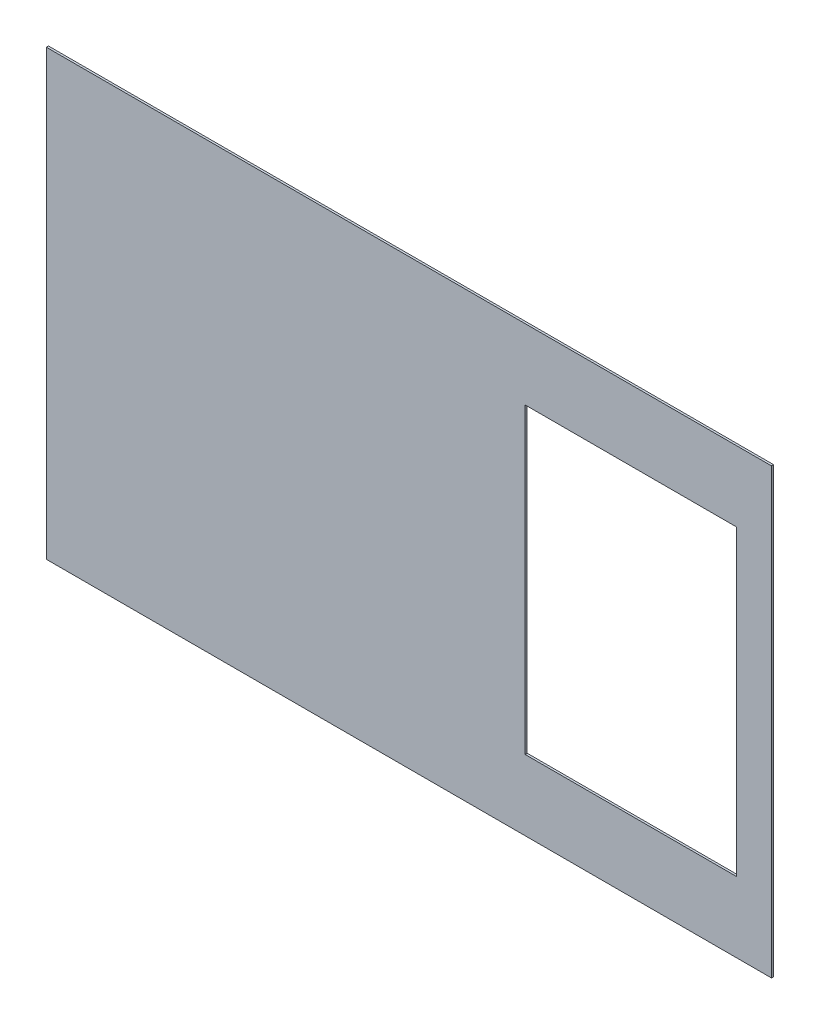
ISO-10303-21;
HEADER;
FILE_DESCRIPTION(('STEP AP214'),'2;1');
FILE_NAME('part.step','',(''),(''),'','','');
FILE_SCHEMA(('AUTOMOTIVE_DESIGN { 1 0 10303 214 1 1 1 1 }'));
ENDSEC;
DATA;
#1=APPLICATION_CONTEXT('core data for automotive mechanical design processes');
#2=APPLICATION_PROTOCOL_DEFINITION('international standard','automotive_design',2000,#1);
#3=PRODUCT_CONTEXT('',#1,'mechanical');
#4=PRODUCT('Part','Part','',(#3));
#5=PRODUCT_RELATED_PRODUCT_CATEGORY('part','',(#4));
#6=PRODUCT_DEFINITION_FORMATION('','',#4);
#7=PRODUCT_DEFINITION_CONTEXT('part definition',#1,'design');
#8=PRODUCT_DEFINITION('design','',#6,#7);
#9=PRODUCT_DEFINITION_SHAPE('','',#8);
#10=(LENGTH_UNIT() NAMED_UNIT(*) SI_UNIT(.MILLI.,.METRE.));
#11=(NAMED_UNIT(*) PLANE_ANGLE_UNIT() SI_UNIT($,.RADIAN.));
#12=(NAMED_UNIT(*) SI_UNIT($,.STERADIAN.) SOLID_ANGLE_UNIT());
#13=UNCERTAINTY_MEASURE_WITH_UNIT(LENGTH_MEASURE(1.E-05),#10,'distance_accuracy_value','');
#14=(GEOMETRIC_REPRESENTATION_CONTEXT(3) GLOBAL_UNCERTAINTY_ASSIGNED_CONTEXT((#13)) GLOBAL_UNIT_ASSIGNED_CONTEXT((#10,
#11,#12)) REPRESENTATION_CONTEXT('',''));
#15=CARTESIAN_POINT('',(0.,0.,0.));
#16=DIRECTION('',(0.,0.,1.));
#17=DIRECTION('',(1.,0.,0.));
#18=AXIS2_PLACEMENT_3D('',#15,#16,#17);
#19=CARTESIAN_POINT('',(515.,-315.,3.));
#20=DIRECTION('',(-1.,0.,0.));
#21=DIRECTION('',(0.,0.,1.));
#22=AXIS2_PLACEMENT_3D('',#19,#20,#21);
#23=PLANE('',#22);
#24=DIRECTION('',(0.,1.,0.));
#25=VECTOR('',#24,1.);
#26=CARTESIAN_POINT('',(515.,-315.,0.));
#27=LINE('',#26,#25);
#28=CARTESIAN_POINT('',(515.,-315.,0.));
#29=VERTEX_POINT('',#28);
#30=CARTESIAN_POINT('',(515.,315.,0.));
#31=VERTEX_POINT('',#30);
#32=EDGE_CURVE('E133',#29,#31,#27,.T.);
#33=ORIENTED_EDGE('',*,*,#32,.T.);
#34=DIRECTION('',(0.,0.,-1.));
#35=VECTOR('',#34,1.);
#36=CARTESIAN_POINT('',(515.,315.,3.));
#37=LINE('',#36,#35);
#38=CARTESIAN_POINT('',(515.,315.,3.));
#39=VERTEX_POINT('',#38);
#40=EDGE_CURVE('E11',#39,#31,#37,.T.);
#41=ORIENTED_EDGE('',*,*,#40,.F.);
#42=DIRECTION('',(0.,1.,0.));
#43=VECTOR('',#42,1.);
#44=CARTESIAN_POINT('',(515.,-315.,3.));
#45=LINE('',#44,#43);
#46=CARTESIAN_POINT('',(515.,-315.,3.));
#47=VERTEX_POINT('',#46);
#48=EDGE_CURVE('E134',#47,#39,#45,.T.);
#49=ORIENTED_EDGE('',*,*,#48,.F.);
#50=DIRECTION('',(0.,0.,-1.));
#51=VECTOR('',#50,1.);
#52=CARTESIAN_POINT('',(515.,-315.,3.));
#53=LINE('',#52,#51);
#54=EDGE_CURVE('E144',#47,#29,#53,.T.);
#55=ORIENTED_EDGE('',*,*,#54,.T.);
#56=EDGE_LOOP('',(#33,#41,#49,#55));
#57=FACE_BOUND('',#56,.T.);
#58=ADVANCED_FACE('F32',(#57),#23,.F.);
#59=CARTESIAN_POINT('',(-515.,315.,3.));
#60=DIRECTION('',(0.,-1.,0.));
#61=DIRECTION('',(0.,0.,-1.));
#62=AXIS2_PLACEMENT_3D('',#59,#60,#61);
#63=PLANE('',#62);
#64=DIRECTION('',(-1.,0.,0.));
#65=VECTOR('',#64,1.);
#66=CARTESIAN_POINT('',(-515.,315.,0.));
#67=LINE('',#66,#65);
#68=CARTESIAN_POINT('',(-515.,315.,0.));
#69=VERTEX_POINT('',#68);
#70=EDGE_CURVE('E147',#31,#69,#67,.T.);
#71=ORIENTED_EDGE('',*,*,#70,.T.);
#72=DIRECTION('',(0.,0.,-1.));
#73=VECTOR('',#72,1.);
#74=CARTESIAN_POINT('',(-515.,315.,3.));
#75=LINE('',#74,#73);
#76=CARTESIAN_POINT('',(-515.,315.,3.));
#77=VERTEX_POINT('',#76);
#78=EDGE_CURVE('E39',#77,#69,#75,.T.);
#79=ORIENTED_EDGE('',*,*,#78,.F.);
#80=DIRECTION('',(-1.,0.,0.));
#81=VECTOR('',#80,1.);
#82=CARTESIAN_POINT('',(-515.,315.,3.));
#83=LINE('',#82,#81);
#84=EDGE_CURVE('E137',#39,#77,#83,.T.);
#85=ORIENTED_EDGE('',*,*,#84,.F.);
#86=ORIENTED_EDGE('',*,*,#40,.T.);
#87=EDGE_LOOP('',(#71,#79,#85,#86));
#88=FACE_BOUND('',#87,.T.);
#89=ADVANCED_FACE('F175',(#88),#63,.F.);
#90=CARTESIAN_POINT('',(-515.,-315.,3.));
#91=DIRECTION('',(1.,0.,0.));
#92=DIRECTION('',(0.,0.,-1.));
#93=AXIS2_PLACEMENT_3D('',#90,#91,#92);
#94=PLANE('',#93);
#95=DIRECTION('',(0.,-1.,0.));
#96=VECTOR('',#95,1.);
#97=CARTESIAN_POINT('',(-515.,-315.,0.));
#98=LINE('',#97,#96);
#99=CARTESIAN_POINT('',(-515.,-315.,0.));
#100=VERTEX_POINT('',#99);
#101=EDGE_CURVE('E149',#69,#100,#98,.T.);
#102=ORIENTED_EDGE('',*,*,#101,.T.);
#103=DIRECTION('',(0.,0.,-1.));
#104=VECTOR('',#103,1.);
#105=CARTESIAN_POINT('',(-515.,-315.,3.));
#106=LINE('',#105,#104);
#107=CARTESIAN_POINT('',(-515.,-315.,3.));
#108=VERTEX_POINT('',#107);
#109=EDGE_CURVE('E154',#108,#100,#106,.T.);
#110=ORIENTED_EDGE('',*,*,#109,.F.);
#111=DIRECTION('',(0.,-1.,0.));
#112=VECTOR('',#111,1.);
#113=CARTESIAN_POINT('',(-515.,-315.,3.));
#114=LINE('',#113,#112);
#115=EDGE_CURVE('E140',#77,#108,#114,.T.);
#116=ORIENTED_EDGE('',*,*,#115,.F.);
#117=ORIENTED_EDGE('',*,*,#78,.T.);
#118=EDGE_LOOP('',(#102,#110,#116,#117));
#119=FACE_BOUND('',#118,.T.);
#120=ADVANCED_FACE('F161',(#119),#94,.F.);
#121=CARTESIAN_POINT('',(-515.,-315.,3.));
#122=DIRECTION('',(0.,1.,0.));
#123=DIRECTION('',(0.,0.,1.));
#124=AXIS2_PLACEMENT_3D('',#121,#122,#123);
#125=PLANE('',#124);
#126=DIRECTION('',(1.,0.,0.));
#127=VECTOR('',#126,1.);
#128=CARTESIAN_POINT('',(-515.,-315.,0.));
#129=LINE('',#128,#127);
#130=EDGE_CURVE('E138',#100,#29,#129,.T.);
#131=ORIENTED_EDGE('',*,*,#130,.T.);
#132=ORIENTED_EDGE('',*,*,#54,.F.);
#133=DIRECTION('',(1.,0.,0.));
#134=VECTOR('',#133,1.);
#135=CARTESIAN_POINT('',(-515.,-315.,3.));
#136=LINE('',#135,#134);
#137=EDGE_CURVE('E142',#108,#47,#136,.T.);
#138=ORIENTED_EDGE('',*,*,#137,.F.);
#139=ORIENTED_EDGE('',*,*,#109,.T.);
#140=EDGE_LOOP('',(#131,#132,#138,#139));
#141=FACE_BOUND('',#140,.T.);
#142=ADVANCED_FACE('F168',(#141),#125,.F.);
#143=CARTESIAN_POINT('',(0.,0.,3.));
#144=DIRECTION('',(0.,0.,-1.));
#145=DIRECTION('',(-1.,0.,0.));
#146=AXIS2_PLACEMENT_3D('',#143,#144,#145);
#147=PLANE('',#146);
#148=DIRECTION('',(-1.,0.,0.));
#149=VECTOR('',#148,1.);
#150=CARTESIAN_POINT('',(0.,-215.,3.));
#151=LINE('',#150,#149);
#152=CARTESIAN_POINT('',(465.,-215.,3.));
#153=VERTEX_POINT('',#152);
#154=CARTESIAN_POINT('',(165.,-215.,3.));
#155=VERTEX_POINT('',#154);
#156=EDGE_CURVE('E127',#153,#155,#151,.T.);
#157=ORIENTED_EDGE('',*,*,#156,.T.);
#158=DIRECTION('',(0.,1.,0.));
#159=VECTOR('',#158,1.);
#160=CARTESIAN_POINT('',(165.,0.,3.));
#161=LINE('',#160,#159);
#162=CARTESIAN_POINT('',(165.,215.,3.));
#163=VERTEX_POINT('',#162);
#164=EDGE_CURVE('E130',#155,#163,#161,.T.);
#165=ORIENTED_EDGE('',*,*,#164,.T.);
#166=DIRECTION('',(1.,0.,0.));
#167=VECTOR('',#166,1.);
#168=CARTESIAN_POINT('',(0.,215.,3.));
#169=LINE('',#168,#167);
#170=CARTESIAN_POINT('',(465.,215.,3.));
#171=VERTEX_POINT('',#170);
#172=EDGE_CURVE('E122',#163,#171,#169,.T.);
#173=ORIENTED_EDGE('',*,*,#172,.T.);
#174=DIRECTION('',(0.,-1.,0.));
#175=VECTOR('',#174,1.);
#176=CARTESIAN_POINT('',(465.,1.20059001500162E-13,3.));
#177=LINE('',#176,#175);
#178=EDGE_CURVE('E102',#171,#153,#177,.T.);
#179=ORIENTED_EDGE('',*,*,#178,.T.);
#180=EDGE_LOOP('',(#157,#165,#173,#179));
#181=FACE_BOUND('',#180,.T.);
#182=ORIENTED_EDGE('',*,*,#48,.T.);
#183=ORIENTED_EDGE('',*,*,#84,.T.);
#184=ORIENTED_EDGE('',*,*,#115,.T.);
#185=ORIENTED_EDGE('',*,*,#137,.T.);
#186=EDGE_LOOP('',(#182,#183,#184,#185));
#187=FACE_BOUND('',#186,.T.);
#188=ADVANCED_FACE('F174',(#181,#187),#147,.F.);
#189=CARTESIAN_POINT('',(0.,0.,0.));
#190=DIRECTION('',(0.,0.,-1.));
#191=DIRECTION('',(-1.,0.,0.));
#192=AXIS2_PLACEMENT_3D('',#189,#190,#191);
#193=PLANE('',#192);
#194=DIRECTION('',(0.,1.,0.));
#195=VECTOR('',#194,1.);
#196=CARTESIAN_POINT('',(165.,215.,0.));
#197=LINE('',#196,#195);
#198=CARTESIAN_POINT('',(165.,-215.,0.));
#199=VERTEX_POINT('',#198);
#200=CARTESIAN_POINT('',(165.,215.,0.));
#201=VERTEX_POINT('',#200);
#202=EDGE_CURVE('E54',#199,#201,#197,.T.);
#203=ORIENTED_EDGE('',*,*,#202,.F.);
#204=DIRECTION('',(-1.,0.,0.));
#205=VECTOR('',#204,1.);
#206=CARTESIAN_POINT('',(165.,-215.,0.));
#207=LINE('',#206,#205);
#208=CARTESIAN_POINT('',(465.,-215.,0.));
#209=VERTEX_POINT('',#208);
#210=EDGE_CURVE('E115',#209,#199,#207,.T.);
#211=ORIENTED_EDGE('',*,*,#210,.F.);
#212=DIRECTION('',(0.,-1.,0.));
#213=VECTOR('',#212,1.);
#214=CARTESIAN_POINT('',(465.,215.,0.));
#215=LINE('',#214,#213);
#216=CARTESIAN_POINT('',(465.,215.,0.));
#217=VERTEX_POINT('',#216);
#218=EDGE_CURVE('E99',#217,#209,#215,.T.);
#219=ORIENTED_EDGE('',*,*,#218,.F.);
#220=DIRECTION('',(1.,0.,0.));
#221=VECTOR('',#220,1.);
#222=CARTESIAN_POINT('',(165.,215.,0.));
#223=LINE('',#222,#221);
#224=EDGE_CURVE('E108',#201,#217,#223,.T.);
#225=ORIENTED_EDGE('',*,*,#224,.F.);
#226=EDGE_LOOP('',(#203,#211,#219,#225));
#227=FACE_BOUND('',#226,.T.);
#228=ORIENTED_EDGE('',*,*,#32,.F.);
#229=ORIENTED_EDGE('',*,*,#130,.F.);
#230=ORIENTED_EDGE('',*,*,#101,.F.);
#231=ORIENTED_EDGE('',*,*,#70,.F.);
#232=EDGE_LOOP('',(#228,#229,#230,#231));
#233=FACE_BOUND('',#232,.T.);
#234=ADVANCED_FACE('F112',(#227,#233),#193,.T.);
#235=CARTESIAN_POINT('',(165.,215.,10.));
#236=DIRECTION('',(-1.,0.,0.));
#237=DIRECTION('',(0.,0.,1.));
#238=AXIS2_PLACEMENT_3D('',#235,#236,#237);
#239=PLANE('',#238);
#240=DIRECTION('',(0.,0.,-1.));
#241=VECTOR('',#240,1.);
#242=CARTESIAN_POINT('',(165.,-215.,10.));
#243=LINE('',#242,#241);
#244=EDGE_CURVE('E120',#155,#199,#243,.T.);
#245=ORIENTED_EDGE('',*,*,#244,.T.);
#246=ORIENTED_EDGE('',*,*,#202,.T.);
#247=DIRECTION('',(0.,0.,-1.));
#248=VECTOR('',#247,1.);
#249=CARTESIAN_POINT('',(165.,215.,10.));
#250=LINE('',#249,#248);
#251=EDGE_CURVE('E105',#163,#201,#250,.T.);
#252=ORIENTED_EDGE('',*,*,#251,.F.);
#253=ORIENTED_EDGE('',*,*,#164,.F.);
#254=EDGE_LOOP('',(#245,#246,#252,#253));
#255=FACE_BOUND('',#254,.T.);
#256=ADVANCED_FACE('F187',(#255),#239,.F.);
#257=CARTESIAN_POINT('',(165.,-215.,10.));
#258=DIRECTION('',(0.,-1.,0.));
#259=DIRECTION('',(0.,0.,-1.));
#260=AXIS2_PLACEMENT_3D('',#257,#258,#259);
#261=PLANE('',#260);
#262=DIRECTION('',(0.,0.,-1.));
#263=VECTOR('',#262,1.);
#264=CARTESIAN_POINT('',(465.,-215.,10.));
#265=LINE('',#264,#263);
#266=EDGE_CURVE('E104',#153,#209,#265,.T.);
#267=ORIENTED_EDGE('',*,*,#266,.T.);
#268=ORIENTED_EDGE('',*,*,#210,.T.);
#269=ORIENTED_EDGE('',*,*,#244,.F.);
#270=ORIENTED_EDGE('',*,*,#156,.F.);
#271=EDGE_LOOP('',(#267,#268,#269,#270));
#272=FACE_BOUND('',#271,.T.);
#273=ADVANCED_FACE('F193',(#272),#261,.F.);
#274=CARTESIAN_POINT('',(465.,215.,10.));
#275=DIRECTION('',(1.,0.,0.));
#276=DIRECTION('',(0.,1.,0.));
#277=AXIS2_PLACEMENT_3D('',#274,#275,#276);
#278=PLANE('',#277);
#279=DIRECTION('',(0.,0.,-1.));
#280=VECTOR('',#279,1.);
#281=CARTESIAN_POINT('',(465.,215.,10.));
#282=LINE('',#281,#280);
#283=EDGE_CURVE('E46',#171,#217,#282,.T.);
#284=ORIENTED_EDGE('',*,*,#283,.T.);
#285=ORIENTED_EDGE('',*,*,#218,.T.);
#286=ORIENTED_EDGE('',*,*,#266,.F.);
#287=ORIENTED_EDGE('',*,*,#178,.F.);
#288=EDGE_LOOP('',(#284,#285,#286,#287));
#289=FACE_BOUND('',#288,.T.);
#290=ADVANCED_FACE('F96',(#289),#278,.F.);
#291=CARTESIAN_POINT('',(165.,215.,10.));
#292=DIRECTION('',(0.,1.,0.));
#293=DIRECTION('',(0.,0.,1.));
#294=AXIS2_PLACEMENT_3D('',#291,#292,#293);
#295=PLANE('',#294);
#296=ORIENTED_EDGE('',*,*,#251,.T.);
#297=ORIENTED_EDGE('',*,*,#224,.T.);
#298=ORIENTED_EDGE('',*,*,#283,.F.);
#299=ORIENTED_EDGE('',*,*,#172,.F.);
#300=EDGE_LOOP('',(#296,#297,#298,#299));
#301=FACE_BOUND('',#300,.T.);
#302=ADVANCED_FACE('F109',(#301),#295,.F.);
#303=CLOSED_SHELL('',(#58,#89,#120,#142,#188,#234,#256,#273,#290,#302));
#304=MANIFOLD_SOLID_BREP('B2',#303);
#305=ADVANCED_BREP_SHAPE_REPRESENTATION('',(#18,#304),#14);
#306=SHAPE_DEFINITION_REPRESENTATION(#9,#305);
ENDSEC;
END-ISO-10303-21;
